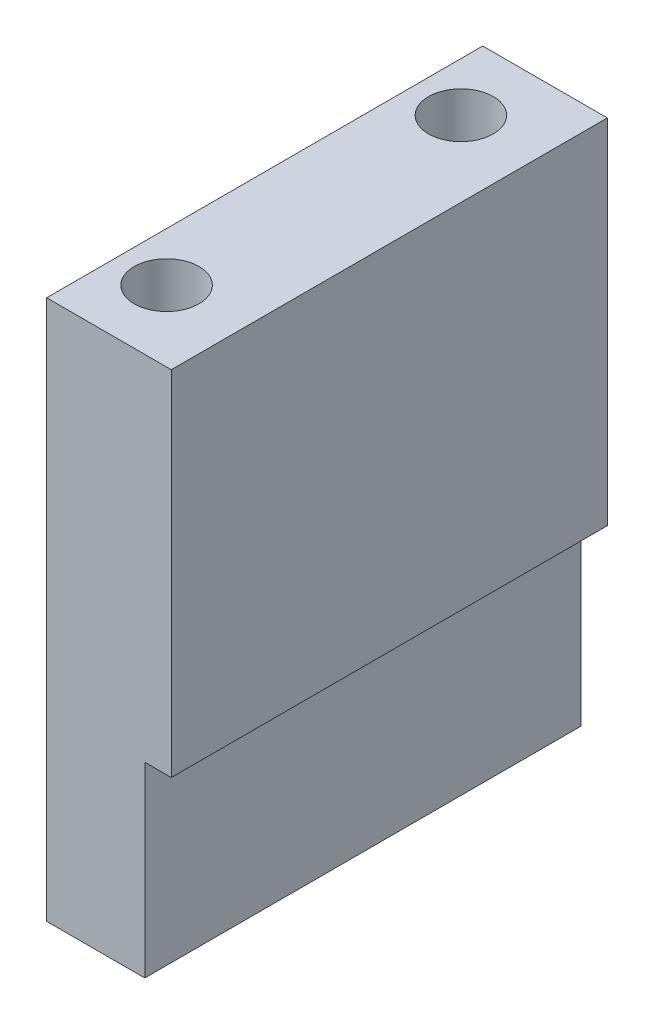
ISO-10303-21;
HEADER;
FILE_DESCRIPTION(('STEP AP214'),'2;1');
FILE_NAME('part.step','',(''),(''),'','','');
FILE_SCHEMA(('AUTOMOTIVE_DESIGN { 1 0 10303 214 1 1 1 1 }'));
ENDSEC;
DATA;
#1=APPLICATION_CONTEXT('core data for automotive mechanical design processes');
#2=APPLICATION_PROTOCOL_DEFINITION('international standard','automotive_design',2000,#1);
#3=PRODUCT_CONTEXT('',#1,'mechanical');
#4=PRODUCT('Part','Part','',(#3));
#5=PRODUCT_RELATED_PRODUCT_CATEGORY('part','',(#4));
#6=PRODUCT_DEFINITION_FORMATION('','',#4);
#7=PRODUCT_DEFINITION_CONTEXT('part definition',#1,'design');
#8=PRODUCT_DEFINITION('design','',#6,#7);
#9=PRODUCT_DEFINITION_SHAPE('','',#8);
#10=(LENGTH_UNIT() NAMED_UNIT(*) SI_UNIT(.MILLI.,.METRE.));
#11=(NAMED_UNIT(*) PLANE_ANGLE_UNIT() SI_UNIT($,.RADIAN.));
#12=(NAMED_UNIT(*) SI_UNIT($,.STERADIAN.) SOLID_ANGLE_UNIT());
#13=UNCERTAINTY_MEASURE_WITH_UNIT(LENGTH_MEASURE(1.E-05),#10,'distance_accuracy_value','');
#14=(GEOMETRIC_REPRESENTATION_CONTEXT(3) GLOBAL_UNCERTAINTY_ASSIGNED_CONTEXT((#13)) GLOBAL_UNIT_ASSIGNED_CONTEXT((#10,
#11,#12)) REPRESENTATION_CONTEXT('',''));
#15=CARTESIAN_POINT('',(0.,0.,0.));
#16=DIRECTION('',(0.,0.,1.));
#17=DIRECTION('',(1.,0.,0.));
#18=AXIS2_PLACEMENT_3D('',#15,#16,#17);
#19=CARTESIAN_POINT('',(6.35,-27.525,22.225));
#20=DIRECTION('',(0.,0.,-1.));
#21=DIRECTION('',(-1.,0.,0.));
#22=AXIS2_PLACEMENT_3D('',#19,#20,#21);
#23=PLANE('',#22);
#24=DIRECTION('',(0.,1.,0.));
#25=VECTOR('',#24,1.);
#26=CARTESIAN_POINT('',(3.65,-27.525,22.225));
#27=LINE('',#26,#25);
#28=CARTESIAN_POINT('',(3.65,-27.525,22.225));
#29=VERTEX_POINT('',#28);
#30=CARTESIAN_POINT('',(3.65,-8.475,22.225));
#31=VERTEX_POINT('',#30);
#32=EDGE_CURVE('E138',#29,#31,#27,.T.);
#33=ORIENTED_EDGE('',*,*,#32,.T.);
#34=DIRECTION('',(1.,0.,0.));
#35=VECTOR('',#34,1.);
#36=CARTESIAN_POINT('',(6.35,-8.475,22.225));
#37=LINE('',#36,#35);
#38=CARTESIAN_POINT('',(6.35,-8.475,22.225));
#39=VERTEX_POINT('',#38);
#40=EDGE_CURVE('E147',#31,#39,#37,.T.);
#41=ORIENTED_EDGE('',*,*,#40,.T.);
#42=DIRECTION('',(0.,-1.,0.));
#43=VECTOR('',#42,1.);
#44=CARTESIAN_POINT('',(6.35,-27.525,22.225));
#45=LINE('',#44,#43);
#46=CARTESIAN_POINT('',(6.35,27.525,22.225));
#47=VERTEX_POINT('',#46);
#48=EDGE_CURVE('E99',#47,#39,#45,.T.);
#49=ORIENTED_EDGE('',*,*,#48,.F.);
#50=DIRECTION('',(-1.,0.,0.));
#51=VECTOR('',#50,1.);
#52=CARTESIAN_POINT('',(6.35,27.525,22.225));
#53=LINE('',#52,#51);
#54=CARTESIAN_POINT('',(-6.35,27.525,22.225));
#55=VERTEX_POINT('',#54);
#56=EDGE_CURVE('E92',#47,#55,#53,.T.);
#57=ORIENTED_EDGE('',*,*,#56,.T.);
#58=DIRECTION('',(0.,-1.,0.));
#59=VECTOR('',#58,1.);
#60=CARTESIAN_POINT('',(-6.35,-27.525,22.225));
#61=LINE('',#60,#59);
#62=CARTESIAN_POINT('',(-6.35,-27.525,22.225));
#63=VERTEX_POINT('',#62);
#64=EDGE_CURVE('E106',#55,#63,#61,.T.);
#65=ORIENTED_EDGE('',*,*,#64,.T.);
#66=DIRECTION('',(-1.,0.,0.));
#67=VECTOR('',#66,1.);
#68=CARTESIAN_POINT('',(6.35,-27.525,22.225));
#69=LINE('',#68,#67);
#70=EDGE_CURVE('E13',#29,#63,#69,.T.);
#71=ORIENTED_EDGE('',*,*,#70,.F.);
#72=EDGE_LOOP('',(#33,#41,#49,#57,#65,#71));
#73=FACE_BOUND('',#72,.T.);
#74=ADVANCED_FACE('F48',(#73),#23,.F.);
#75=CARTESIAN_POINT('',(6.35,-27.525,-22.225));
#76=DIRECTION('',(0.,1.,0.));
#77=DIRECTION('',(0.,0.,1.));
#78=AXIS2_PLACEMENT_3D('',#75,#76,#77);
#79=PLANE('',#78);
#80=CARTESIAN_POINT('',(-1.35,-27.525,-15.));
#81=DIRECTION('',(0.,-1.,0.));
#82=DIRECTION('',(0.,0.,-1.));
#83=AXIS2_PLACEMENT_3D('',#80,#81,#82);
#84=CIRCLE('',#83,3.29999999999999);
#85=CARTESIAN_POINT('',(-1.35,-27.525,-18.3));
#86=VERTEX_POINT('',#85);
#87=EDGE_CURVE('E167',#86,#86,#84,.T.);
#88=ORIENTED_EDGE('',*,*,#87,.F.);
#89=EDGE_LOOP('',(#88));
#90=FACE_BOUND('',#89,.T.);
#91=CARTESIAN_POINT('',(-1.35,-27.525,15.));
#92=DIRECTION('',(0.,-1.,0.));
#93=DIRECTION('',(0.,0.,-1.));
#94=AXIS2_PLACEMENT_3D('',#91,#92,#93);
#95=CIRCLE('',#94,3.29999999999999);
#96=CARTESIAN_POINT('',(-1.35,-27.525,11.7));
#97=VERTEX_POINT('',#96);
#98=EDGE_CURVE('E161',#97,#97,#95,.T.);
#99=ORIENTED_EDGE('',*,*,#98,.F.);
#100=EDGE_LOOP('',(#99));
#101=FACE_BOUND('',#100,.T.);
#102=DIRECTION('',(-1.,0.,0.));
#103=VECTOR('',#102,1.);
#104=CARTESIAN_POINT('',(6.35,-27.525,-22.225));
#105=LINE('',#104,#103);
#106=CARTESIAN_POINT('',(3.65,-27.525,-22.225));
#107=VERTEX_POINT('',#106);
#108=CARTESIAN_POINT('',(-6.35,-27.525,-22.225));
#109=VERTEX_POINT('',#108);
#110=EDGE_CURVE('E55',#107,#109,#105,.T.);
#111=ORIENTED_EDGE('',*,*,#110,.F.);
#112=DIRECTION('',(0.,0.,-1.));
#113=VECTOR('',#112,1.);
#114=CARTESIAN_POINT('',(3.65,-27.525,22.225));
#115=LINE('',#114,#113);
#116=EDGE_CURVE('E135',#29,#107,#115,.T.);
#117=ORIENTED_EDGE('',*,*,#116,.F.);
#118=ORIENTED_EDGE('',*,*,#70,.T.);
#119=DIRECTION('',(0.,0.,-1.));
#120=VECTOR('',#119,1.);
#121=CARTESIAN_POINT('',(-6.35,-27.525,-22.225));
#122=LINE('',#121,#120);
#123=EDGE_CURVE('E112',#63,#109,#122,.T.);
#124=ORIENTED_EDGE('',*,*,#123,.T.);
#125=EDGE_LOOP('',(#111,#117,#118,#124));
#126=FACE_BOUND('',#125,.T.);
#127=ADVANCED_FACE('F132',(#90,#101,#126),#79,.F.);
#128=CARTESIAN_POINT('',(6.35,-27.525,-22.225));
#129=DIRECTION('',(0.,0.,1.));
#130=DIRECTION('',(1.,0.,0.));
#131=AXIS2_PLACEMENT_3D('',#128,#129,#130);
#132=PLANE('',#131);
#133=DIRECTION('',(0.,1.,0.));
#134=VECTOR('',#133,1.);
#135=CARTESIAN_POINT('',(6.35,-27.525,-22.225));
#136=LINE('',#135,#134);
#137=CARTESIAN_POINT('',(6.35,-8.475,-22.225));
#138=VERTEX_POINT('',#137);
#139=CARTESIAN_POINT('',(6.35,27.525,-22.225));
#140=VERTEX_POINT('',#139);
#141=EDGE_CURVE('E152',#138,#140,#136,.T.);
#142=ORIENTED_EDGE('',*,*,#141,.F.);
#143=DIRECTION('',(1.,0.,0.));
#144=VECTOR('',#143,1.);
#145=CARTESIAN_POINT('',(6.35,-8.475,-22.225));
#146=LINE('',#145,#144);
#147=CARTESIAN_POINT('',(3.65,-8.475,-22.225));
#148=VERTEX_POINT('',#147);
#149=EDGE_CURVE('E62',#148,#138,#146,.T.);
#150=ORIENTED_EDGE('',*,*,#149,.F.);
#151=DIRECTION('',(0.,1.,0.));
#152=VECTOR('',#151,1.);
#153=CARTESIAN_POINT('',(3.65,-27.525,-22.225));
#154=LINE('',#153,#152);
#155=EDGE_CURVE('E129',#107,#148,#154,.T.);
#156=ORIENTED_EDGE('',*,*,#155,.F.);
#157=ORIENTED_EDGE('',*,*,#110,.T.);
#158=DIRECTION('',(0.,1.,0.));
#159=VECTOR('',#158,1.);
#160=CARTESIAN_POINT('',(-6.35,-27.525,-22.225));
#161=LINE('',#160,#159);
#162=CARTESIAN_POINT('',(-6.35,27.525,-22.225));
#163=VERTEX_POINT('',#162);
#164=EDGE_CURVE('E100',#109,#163,#161,.T.);
#165=ORIENTED_EDGE('',*,*,#164,.T.);
#166=DIRECTION('',(-1.,0.,0.));
#167=VECTOR('',#166,1.);
#168=CARTESIAN_POINT('',(6.35,27.525,-22.225));
#169=LINE('',#168,#167);
#170=EDGE_CURVE('E95',#140,#163,#169,.T.);
#171=ORIENTED_EDGE('',*,*,#170,.F.);
#172=EDGE_LOOP('',(#142,#150,#156,#157,#165,#171));
#173=FACE_BOUND('',#172,.T.);
#174=ADVANCED_FACE('F126',(#173),#132,.F.);
#175=CARTESIAN_POINT('',(6.35,27.525,-22.225));
#176=DIRECTION('',(0.,-1.,0.));
#177=DIRECTION('',(0.,0.,-1.));
#178=AXIS2_PLACEMENT_3D('',#175,#176,#177);
#179=PLANE('',#178);
#180=CARTESIAN_POINT('',(-1.35,27.525,-15.));
#181=DIRECTION('',(0.,-1.,0.));
#182=DIRECTION('',(0.,0.,-1.));
#183=AXIS2_PLACEMENT_3D('',#180,#181,#182);
#184=CIRCLE('',#183,3.29999999999999);
#185=CARTESIAN_POINT('',(-1.35,27.525,-18.3));
#186=VERTEX_POINT('',#185);
#187=EDGE_CURVE('E164',#186,#186,#184,.T.);
#188=ORIENTED_EDGE('',*,*,#187,.T.);
#189=EDGE_LOOP('',(#188));
#190=FACE_BOUND('',#189,.T.);
#191=CARTESIAN_POINT('',(-1.35,27.525,15.));
#192=DIRECTION('',(0.,-1.,0.));
#193=DIRECTION('',(0.,0.,-1.));
#194=AXIS2_PLACEMENT_3D('',#191,#192,#193);
#195=CIRCLE('',#194,3.29999999999999);
#196=CARTESIAN_POINT('',(-1.35,27.525,11.7));
#197=VERTEX_POINT('',#196);
#198=EDGE_CURVE('E156',#197,#197,#195,.T.);
#199=ORIENTED_EDGE('',*,*,#198,.T.);
#200=EDGE_LOOP('',(#199));
#201=FACE_BOUND('',#200,.T.);
#202=DIRECTION('',(0.,0.,1.));
#203=VECTOR('',#202,1.);
#204=CARTESIAN_POINT('',(-6.35,27.525,-22.225));
#205=LINE('',#204,#203);
#206=EDGE_CURVE('E89',#163,#55,#205,.T.);
#207=ORIENTED_EDGE('',*,*,#206,.T.);
#208=ORIENTED_EDGE('',*,*,#56,.F.);
#209=DIRECTION('',(0.,0.,1.));
#210=VECTOR('',#209,1.);
#211=CARTESIAN_POINT('',(6.35,27.525,-22.225));
#212=LINE('',#211,#210);
#213=EDGE_CURVE('E71',#140,#47,#212,.T.);
#214=ORIENTED_EDGE('',*,*,#213,.F.);
#215=ORIENTED_EDGE('',*,*,#170,.T.);
#216=EDGE_LOOP('',(#207,#208,#214,#215));
#217=FACE_BOUND('',#216,.T.);
#218=ADVANCED_FACE('F91',(#190,#201,#217),#179,.F.);
#219=CARTESIAN_POINT('',(6.35,0.,0.));
#220=DIRECTION('',(1.,0.,0.));
#221=DIRECTION('',(0.,0.,-1.));
#222=AXIS2_PLACEMENT_3D('',#219,#220,#221);
#223=PLANE('',#222);
#224=DIRECTION('',(0.,0.,-1.));
#225=VECTOR('',#224,1.);
#226=CARTESIAN_POINT('',(6.35,-8.475,22.225));
#227=LINE('',#226,#225);
#228=EDGE_CURVE('E113',#39,#138,#227,.T.);
#229=ORIENTED_EDGE('',*,*,#228,.T.);
#230=ORIENTED_EDGE('',*,*,#141,.T.);
#231=ORIENTED_EDGE('',*,*,#213,.T.);
#232=ORIENTED_EDGE('',*,*,#48,.T.);
#233=EDGE_LOOP('',(#229,#230,#231,#232));
#234=FACE_BOUND('',#233,.T.);
#235=ADVANCED_FACE('F153',(#234),#223,.T.);
#236=CARTESIAN_POINT('',(-6.35,0.,0.));
#237=DIRECTION('',(1.,0.,0.));
#238=DIRECTION('',(0.,0.,-1.));
#239=AXIS2_PLACEMENT_3D('',#236,#237,#238);
#240=PLANE('',#239);
#241=ORIENTED_EDGE('',*,*,#64,.F.);
#242=ORIENTED_EDGE('',*,*,#206,.F.);
#243=ORIENTED_EDGE('',*,*,#164,.F.);
#244=ORIENTED_EDGE('',*,*,#123,.F.);
#245=EDGE_LOOP('',(#241,#242,#243,#244));
#246=FACE_BOUND('',#245,.T.);
#247=ADVANCED_FACE('F110',(#246),#240,.F.);
#248=CARTESIAN_POINT('',(6.35,-8.475,22.225));
#249=DIRECTION('',(0.,1.,0.));
#250=DIRECTION('',(0.,0.,1.));
#251=AXIS2_PLACEMENT_3D('',#248,#249,#250);
#252=PLANE('',#251);
#253=ORIENTED_EDGE('',*,*,#149,.T.);
#254=ORIENTED_EDGE('',*,*,#228,.F.);
#255=ORIENTED_EDGE('',*,*,#40,.F.);
#256=DIRECTION('',(0.,0.,-1.));
#257=VECTOR('',#256,1.);
#258=CARTESIAN_POINT('',(3.65,-8.475,22.225));
#259=LINE('',#258,#257);
#260=EDGE_CURVE('E116',#31,#148,#259,.T.);
#261=ORIENTED_EDGE('',*,*,#260,.T.);
#262=EDGE_LOOP('',(#253,#254,#255,#261));
#263=FACE_BOUND('',#262,.T.);
#264=ADVANCED_FACE('F187',(#263),#252,.F.);
#265=CARTESIAN_POINT('',(3.65,-27.525,22.225));
#266=DIRECTION('',(-1.,0.,0.));
#267=DIRECTION('',(0.,0.,1.));
#268=AXIS2_PLACEMENT_3D('',#265,#266,#267);
#269=PLANE('',#268);
#270=ORIENTED_EDGE('',*,*,#155,.T.);
#271=ORIENTED_EDGE('',*,*,#260,.F.);
#272=ORIENTED_EDGE('',*,*,#32,.F.);
#273=ORIENTED_EDGE('',*,*,#116,.T.);
#274=EDGE_LOOP('',(#270,#271,#272,#273));
#275=FACE_BOUND('',#274,.T.);
#276=ADVANCED_FACE('F146',(#275),#269,.F.);
#277=CARTESIAN_POINT('',(-1.35,-27.525,15.));
#278=DIRECTION('',(0.,-1.,0.));
#279=DIRECTION('',(0.,0.,-1.));
#280=AXIS2_PLACEMENT_3D('',#277,#278,#279);
#281=CYLINDRICAL_SURFACE('',#280,3.29999999999999);
#282=ORIENTED_EDGE('',*,*,#198,.F.);
#283=EDGE_LOOP('',(#282));
#284=FACE_BOUND('',#283,.T.);
#285=ORIENTED_EDGE('',*,*,#98,.T.);
#286=EDGE_LOOP('',(#285));
#287=FACE_BOUND('',#286,.T.);
#288=ADVANCED_FACE('F177',(#284,#287),#281,.F.);
#289=CARTESIAN_POINT('',(-1.35,-27.525,-15.));
#290=DIRECTION('',(0.,-1.,0.));
#291=DIRECTION('',(0.,0.,-1.));
#292=AXIS2_PLACEMENT_3D('',#289,#290,#291);
#293=CYLINDRICAL_SURFACE('',#292,3.29999999999999);
#294=ORIENTED_EDGE('',*,*,#187,.F.);
#295=EDGE_LOOP('',(#294));
#296=FACE_BOUND('',#295,.T.);
#297=ORIENTED_EDGE('',*,*,#87,.T.);
#298=EDGE_LOOP('',(#297));
#299=FACE_BOUND('',#298,.T.);
#300=ADVANCED_FACE('F171',(#296,#299),#293,.F.);
#301=CLOSED_SHELL('',(#74,#127,#174,#218,#235,#247,#264,#276,#288,#300));
#302=MANIFOLD_SOLID_BREP('B2',#301);
#303=ADVANCED_BREP_SHAPE_REPRESENTATION('',(#18,#302),#14);
#304=SHAPE_DEFINITION_REPRESENTATION(#9,#303);
ENDSEC;
END-ISO-10303-21;
